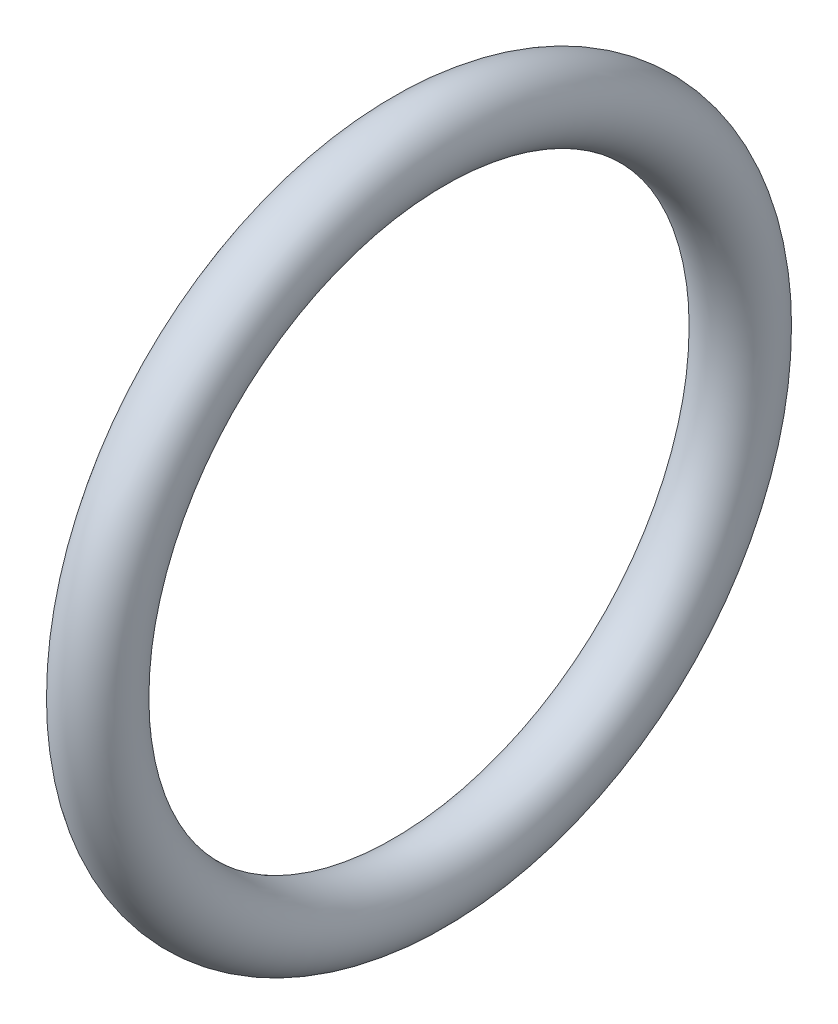
ISO-10303-21;
HEADER;
FILE_DESCRIPTION(('STEP AP214'),'2;1');
FILE_NAME('part.step','',(''),(''),'','','');
FILE_SCHEMA(('AUTOMOTIVE_DESIGN { 1 0 10303 214 1 1 1 1 }'));
ENDSEC;
DATA;
#1=APPLICATION_CONTEXT('core data for automotive mechanical design processes');
#2=APPLICATION_PROTOCOL_DEFINITION('international standard','automotive_design',2000,#1);
#3=PRODUCT_CONTEXT('',#1,'mechanical');
#4=PRODUCT('Part','Part','',(#3));
#5=PRODUCT_RELATED_PRODUCT_CATEGORY('part','',(#4));
#6=PRODUCT_DEFINITION_FORMATION('','',#4);
#7=PRODUCT_DEFINITION_CONTEXT('part definition',#1,'design');
#8=PRODUCT_DEFINITION('design','',#6,#7);
#9=PRODUCT_DEFINITION_SHAPE('','',#8);
#10=(LENGTH_UNIT() NAMED_UNIT(*) SI_UNIT(.MILLI.,.METRE.));
#11=(NAMED_UNIT(*) PLANE_ANGLE_UNIT() SI_UNIT($,.RADIAN.));
#12=(NAMED_UNIT(*) SI_UNIT($,.STERADIAN.) SOLID_ANGLE_UNIT());
#13=UNCERTAINTY_MEASURE_WITH_UNIT(LENGTH_MEASURE(1.E-05),#10,'distance_accuracy_value','');
#14=(GEOMETRIC_REPRESENTATION_CONTEXT(3) GLOBAL_UNCERTAINTY_ASSIGNED_CONTEXT((#13)) GLOBAL_UNIT_ASSIGNED_CONTEXT((#10,
#11,#12)) REPRESENTATION_CONTEXT('',''));
#15=CARTESIAN_POINT('',(0.,0.,0.));
#16=DIRECTION('',(0.,0.,1.));
#17=DIRECTION('',(1.,0.,0.));
#18=AXIS2_PLACEMENT_3D('',#15,#16,#17);
#19=CARTESIAN_POINT('',(0.,0.,0.));
#20=DIRECTION('',(-1.,0.,0.));
#21=DIRECTION('',(0.,0.,1.));
#22=AXIS2_PLACEMENT_3D('',#19,#20,#21);
#23=TOROIDAL_SURFACE('',#22,13.75,1.55);
#24=CARTESIAN_POINT('',(0.,0.,15.3));
#25=VERTEX_POINT('',#24);
#26=VERTEX_LOOP('',#25);
#27=FACE_BOUND('',#26,.T.);
#28=ADVANCED_FACE('F31',(#27),#23,.T.);
#29=CLOSED_SHELL('',(#28));
#30=MANIFOLD_SOLID_BREP('B2',#29);
#31=ADVANCED_BREP_SHAPE_REPRESENTATION('',(#18,#30),#14);
#32=SHAPE_DEFINITION_REPRESENTATION(#9,#31);
ENDSEC;
END-ISO-10303-21;
